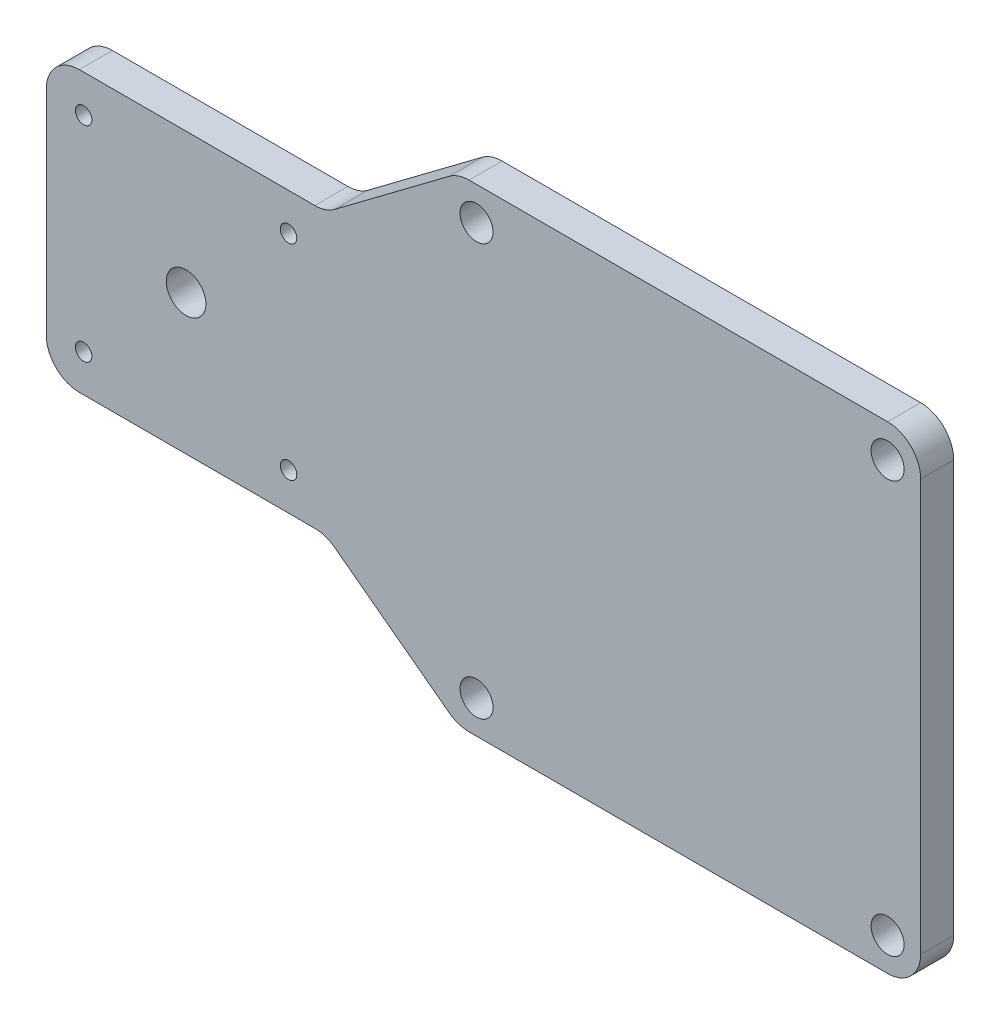
ISO-10303-21;
HEADER;
FILE_DESCRIPTION(('STEP AP214'),'2;1');
FILE_NAME('part.step','',(''),(''),'','','');
FILE_SCHEMA(('AUTOMOTIVE_DESIGN { 1 0 10303 214 1 1 1 1 }'));
ENDSEC;
DATA;
#1=APPLICATION_CONTEXT('core data for automotive mechanical design processes');
#2=APPLICATION_PROTOCOL_DEFINITION('international standard','automotive_design',2000,#1);
#3=PRODUCT_CONTEXT('',#1,'mechanical');
#4=PRODUCT('Part','Part','',(#3));
#5=PRODUCT_RELATED_PRODUCT_CATEGORY('part','',(#4));
#6=PRODUCT_DEFINITION_FORMATION('','',#4);
#7=PRODUCT_DEFINITION_CONTEXT('part definition',#1,'design');
#8=PRODUCT_DEFINITION('design','',#6,#7);
#9=PRODUCT_DEFINITION_SHAPE('','',#8);
#10=(LENGTH_UNIT() NAMED_UNIT(*) SI_UNIT(.MILLI.,.METRE.));
#11=(NAMED_UNIT(*) PLANE_ANGLE_UNIT() SI_UNIT($,.RADIAN.));
#12=(NAMED_UNIT(*) SI_UNIT($,.STERADIAN.) SOLID_ANGLE_UNIT());
#13=UNCERTAINTY_MEASURE_WITH_UNIT(LENGTH_MEASURE(1.E-05),#10,'distance_accuracy_value','');
#14=(GEOMETRIC_REPRESENTATION_CONTEXT(3) GLOBAL_UNCERTAINTY_ASSIGNED_CONTEXT((#13)) GLOBAL_UNIT_ASSIGNED_CONTEXT((#10,
#11,#12)) REPRESENTATION_CONTEXT('',''));
#15=CARTESIAN_POINT('',(0.,0.,0.));
#16=DIRECTION('',(0.,0.,1.));
#17=DIRECTION('',(1.,0.,0.));
#18=AXIS2_PLACEMENT_3D('',#15,#16,#17);
#19=CARTESIAN_POINT('',(-21.15,21.15,5.));
#20=DIRECTION('',(0.,-1.,0.));
#21=DIRECTION('',(0.,0.,-1.));
#22=AXIS2_PLACEMENT_3D('',#19,#20,#21);
#23=PLANE('',#22);
#24=DIRECTION('',(-1.,0.,0.));
#25=VECTOR('',#24,1.);
#26=CARTESIAN_POINT('',(-21.15,21.15,5.));
#27=LINE('',#26,#25);
#28=CARTESIAN_POINT('',(19.4833333333333,21.15,5.));
#29=VERTEX_POINT('',#28);
#30=CARTESIAN_POINT('',(-16.15,21.15,5.));
#31=VERTEX_POINT('',#30);
#32=EDGE_CURVE('E188',#29,#31,#27,.T.);
#33=ORIENTED_EDGE('',*,*,#32,.F.);
#34=DIRECTION('',(0.,0.,-1.));
#35=VECTOR('',#34,1.);
#36=CARTESIAN_POINT('',(19.4833333333333,21.15,0.));
#37=LINE('',#36,#35);
#38=CARTESIAN_POINT('',(19.4833333333333,21.15,0.));
#39=VERTEX_POINT('',#38);
#40=EDGE_CURVE('E204',#29,#39,#37,.T.);
#41=ORIENTED_EDGE('',*,*,#40,.T.);
#42=DIRECTION('',(-1.,0.,0.));
#43=VECTOR('',#42,1.);
#44=CARTESIAN_POINT('',(-21.15,21.15,0.));
#45=LINE('',#44,#43);
#46=CARTESIAN_POINT('',(-16.15,21.15,0.));
#47=VERTEX_POINT('',#46);
#48=EDGE_CURVE('E178',#39,#47,#45,.T.);
#49=ORIENTED_EDGE('',*,*,#48,.T.);
#50=DIRECTION('',(0.,0.,-1.));
#51=VECTOR('',#50,1.);
#52=CARTESIAN_POINT('',(-16.15,21.15,5.));
#53=LINE('',#52,#51);
#54=EDGE_CURVE('E199',#47,#31,#53,.F.);
#55=ORIENTED_EDGE('',*,*,#54,.T.);
#56=EDGE_LOOP('',(#33,#41,#49,#55));
#57=FACE_BOUND('',#56,.T.);
#58=ADVANCED_FACE('F33',(#57),#23,.F.);
#59=CARTESIAN_POINT('',(-21.15,-21.15,5.));
#60=DIRECTION('',(1.,0.,0.));
#61=DIRECTION('',(0.,0.,-1.));
#62=AXIS2_PLACEMENT_3D('',#59,#60,#61);
#63=PLANE('',#62);
#64=DIRECTION('',(0.,-1.,0.));
#65=VECTOR('',#64,1.);
#66=CARTESIAN_POINT('',(-21.15,-21.15,5.));
#67=LINE('',#66,#65);
#68=CARTESIAN_POINT('',(-21.15,16.15,5.));
#69=VERTEX_POINT('',#68);
#70=CARTESIAN_POINT('',(-21.15,-16.15,5.));
#71=VERTEX_POINT('',#70);
#72=EDGE_CURVE('E301',#69,#71,#67,.T.);
#73=ORIENTED_EDGE('',*,*,#72,.F.);
#74=DIRECTION('',(0.,0.,-1.));
#75=VECTOR('',#74,1.);
#76=CARTESIAN_POINT('',(-21.15,16.15,5.));
#77=LINE('',#76,#75);
#78=CARTESIAN_POINT('',(-21.15,16.15,0.));
#79=VERTEX_POINT('',#78);
#80=EDGE_CURVE('E193',#69,#79,#77,.T.);
#81=ORIENTED_EDGE('',*,*,#80,.T.);
#82=DIRECTION('',(0.,-1.,0.));
#83=VECTOR('',#82,1.);
#84=CARTESIAN_POINT('',(-21.15,-21.15,0.));
#85=LINE('',#84,#83);
#86=CARTESIAN_POINT('',(-21.15,-16.15,0.));
#87=VERTEX_POINT('',#86);
#88=EDGE_CURVE('E173',#79,#87,#85,.T.);
#89=ORIENTED_EDGE('',*,*,#88,.T.);
#90=DIRECTION('',(0.,0.,-1.));
#91=VECTOR('',#90,1.);
#92=CARTESIAN_POINT('',(-21.15,-16.15,5.));
#93=LINE('',#92,#91);
#94=EDGE_CURVE('E155',#87,#71,#93,.F.);
#95=ORIENTED_EDGE('',*,*,#94,.T.);
#96=EDGE_LOOP('',(#73,#81,#89,#95));
#97=FACE_BOUND('',#96,.T.);
#98=ADVANCED_FACE('F385',(#97),#63,.F.);
#99=CARTESIAN_POINT('',(-21.15,-21.15,5.));
#100=DIRECTION('',(0.,1.,0.));
#101=DIRECTION('',(0.,0.,1.));
#102=AXIS2_PLACEMENT_3D('',#99,#100,#101);
#103=PLANE('',#102);
#104=DIRECTION('',(1.,0.,0.));
#105=VECTOR('',#104,1.);
#106=CARTESIAN_POINT('',(-21.15,-21.15,0.));
#107=LINE('',#106,#105);
#108=CARTESIAN_POINT('',(-16.15,-21.15,0.));
#109=VERTEX_POINT('',#108);
#110=CARTESIAN_POINT('',(19.4833333333333,-21.15,0.));
#111=VERTEX_POINT('',#110);
#112=EDGE_CURVE('E163',#109,#111,#107,.T.);
#113=ORIENTED_EDGE('',*,*,#112,.T.);
#114=DIRECTION('',(0.,0.,-1.));
#115=VECTOR('',#114,1.);
#116=CARTESIAN_POINT('',(19.4833333333333,-21.15,5.));
#117=LINE('',#116,#115);
#118=CARTESIAN_POINT('',(19.4833333333333,-21.15,5.));
#119=VERTEX_POINT('',#118);
#120=EDGE_CURVE('E218',#111,#119,#117,.F.);
#121=ORIENTED_EDGE('',*,*,#120,.T.);
#122=DIRECTION('',(1.,0.,0.));
#123=VECTOR('',#122,1.);
#124=CARTESIAN_POINT('',(-21.15,-21.15,5.));
#125=LINE('',#124,#123);
#126=CARTESIAN_POINT('',(-16.15,-21.15,5.));
#127=VERTEX_POINT('',#126);
#128=EDGE_CURVE('E166',#127,#119,#125,.T.);
#129=ORIENTED_EDGE('',*,*,#128,.F.);
#130=DIRECTION('',(0.,0.,-1.));
#131=VECTOR('',#130,1.);
#132=CARTESIAN_POINT('',(-16.15,-21.15,5.));
#133=LINE('',#132,#131);
#134=EDGE_CURVE('E153',#127,#109,#133,.T.);
#135=ORIENTED_EDGE('',*,*,#134,.T.);
#136=EDGE_LOOP('',(#113,#121,#129,#135));
#137=FACE_BOUND('',#136,.T.);
#138=ADVANCED_FACE('F162',(#137),#103,.F.);
#139=CARTESIAN_POINT('',(21.15,-21.15,5.));
#140=DIRECTION('',(0.6,0.8,0.));
#141=DIRECTION('',(-0.8,0.6,0.));
#142=AXIS2_PLACEMENT_3D('',#139,#140,#141);
#143=PLANE('',#142);
#144=DIRECTION('',(0.8,-0.6,0.));
#145=VECTOR('',#144,1.);
#146=CARTESIAN_POINT('',(21.15,-21.15,0.));
#147=LINE('',#146,#145);
#148=CARTESIAN_POINT('',(22.4833333333333,-22.15,0.));
#149=VERTEX_POINT('',#148);
#150=CARTESIAN_POINT('',(39.8166666666667,-35.15,0.));
#151=VERTEX_POINT('',#150);
#152=EDGE_CURVE('E172',#149,#151,#147,.T.);
#153=ORIENTED_EDGE('',*,*,#152,.T.);
#154=DIRECTION('',(0.,0.,-1.));
#155=VECTOR('',#154,1.);
#156=CARTESIAN_POINT('',(39.8166666666667,-35.15,5.));
#157=LINE('',#156,#155);
#158=CARTESIAN_POINT('',(39.8166666666667,-35.15,5.));
#159=VERTEX_POINT('',#158);
#160=EDGE_CURVE('E228',#151,#159,#157,.F.);
#161=ORIENTED_EDGE('',*,*,#160,.T.);
#162=DIRECTION('',(0.8,-0.6,0.));
#163=VECTOR('',#162,1.);
#164=CARTESIAN_POINT('',(21.15,-21.15,5.));
#165=LINE('',#164,#163);
#166=CARTESIAN_POINT('',(22.4833333333333,-22.15,5.));
#167=VERTEX_POINT('',#166);
#168=EDGE_CURVE('E297',#167,#159,#165,.T.);
#169=ORIENTED_EDGE('',*,*,#168,.F.);
#170=DIRECTION('',(0.,0.,-1.));
#171=VECTOR('',#170,1.);
#172=CARTESIAN_POINT('',(22.4833333333333,-22.15,0.));
#173=LINE('',#172,#171);
#174=EDGE_CURVE('E215',#167,#149,#173,.T.);
#175=ORIENTED_EDGE('',*,*,#174,.T.);
#176=EDGE_LOOP('',(#153,#161,#169,#175));
#177=FACE_BOUND('',#176,.T.);
#178=ADVANCED_FACE('F392',(#177),#143,.F.);
#179=CARTESIAN_POINT('',(41.15,-36.15,5.));
#180=DIRECTION('',(0.,1.,0.));
#181=DIRECTION('',(-1.,0.,0.));
#182=AXIS2_PLACEMENT_3D('',#179,#180,#181);
#183=PLANE('',#182);
#184=DIRECTION('',(1.,0.,0.));
#185=VECTOR('',#184,1.);
#186=CARTESIAN_POINT('',(41.15,-36.15,0.));
#187=LINE('',#186,#185);
#188=CARTESIAN_POINT('',(42.8166666666667,-36.15,0.));
#189=VERTEX_POINT('',#188);
#190=CARTESIAN_POINT('',(106.15,-36.15,0.));
#191=VERTEX_POINT('',#190);
#192=EDGE_CURVE('E176',#189,#191,#187,.T.);
#193=ORIENTED_EDGE('',*,*,#192,.T.);
#194=DIRECTION('',(0.,0.,-1.));
#195=VECTOR('',#194,1.);
#196=CARTESIAN_POINT('',(106.15,-36.15,5.));
#197=LINE('',#196,#195);
#198=CARTESIAN_POINT('',(106.15,-36.15,5.));
#199=VERTEX_POINT('',#198);
#200=EDGE_CURVE('E42',#191,#199,#197,.F.);
#201=ORIENTED_EDGE('',*,*,#200,.T.);
#202=DIRECTION('',(1.,0.,0.));
#203=VECTOR('',#202,1.);
#204=CARTESIAN_POINT('',(41.15,-36.15,5.));
#205=LINE('',#204,#203);
#206=CARTESIAN_POINT('',(42.8166666666667,-36.15,5.));
#207=VERTEX_POINT('',#206);
#208=EDGE_CURVE('E295',#207,#199,#205,.T.);
#209=ORIENTED_EDGE('',*,*,#208,.F.);
#210=DIRECTION('',(0.,0.,-1.));
#211=VECTOR('',#210,1.);
#212=CARTESIAN_POINT('',(42.8166666666667,-36.15,5.));
#213=LINE('',#212,#211);
#214=EDGE_CURVE('E223',#207,#189,#213,.T.);
#215=ORIENTED_EDGE('',*,*,#214,.T.);
#216=EDGE_LOOP('',(#193,#201,#209,#215));
#217=FACE_BOUND('',#216,.T.);
#218=ADVANCED_FACE('F396',(#217),#183,.F.);
#219=CARTESIAN_POINT('',(111.15,36.15,5.));
#220=DIRECTION('',(-1.,0.,0.));
#221=DIRECTION('',(0.,-1.,0.));
#222=AXIS2_PLACEMENT_3D('',#219,#220,#221);
#223=PLANE('',#222);
#224=DIRECTION('',(0.,1.,0.));
#225=VECTOR('',#224,1.);
#226=CARTESIAN_POINT('',(111.15,36.15,5.));
#227=LINE('',#226,#225);
#228=CARTESIAN_POINT('',(111.15,-31.15,5.));
#229=VERTEX_POINT('',#228);
#230=CARTESIAN_POINT('',(111.15,31.15,5.));
#231=VERTEX_POINT('',#230);
#232=EDGE_CURVE('E293',#229,#231,#227,.T.);
#233=ORIENTED_EDGE('',*,*,#232,.F.);
#234=DIRECTION('',(0.,0.,-1.));
#235=VECTOR('',#234,1.);
#236=CARTESIAN_POINT('',(111.15,-31.15,5.));
#237=LINE('',#236,#235);
#238=CARTESIAN_POINT('',(111.15,-31.15,0.));
#239=VERTEX_POINT('',#238);
#240=EDGE_CURVE('E254',#229,#239,#237,.T.);
#241=ORIENTED_EDGE('',*,*,#240,.T.);
#242=DIRECTION('',(0.,1.,0.));
#243=VECTOR('',#242,1.);
#244=CARTESIAN_POINT('',(111.15,36.15,0.));
#245=LINE('',#244,#243);
#246=CARTESIAN_POINT('',(111.15,31.15,0.));
#247=VERTEX_POINT('',#246);
#248=EDGE_CURVE('E183',#239,#247,#245,.T.);
#249=ORIENTED_EDGE('',*,*,#248,.T.);
#250=DIRECTION('',(0.,0.,-1.));
#251=VECTOR('',#250,1.);
#252=CARTESIAN_POINT('',(111.15,31.15,5.));
#253=LINE('',#252,#251);
#254=EDGE_CURVE('E249',#247,#231,#253,.F.);
#255=ORIENTED_EDGE('',*,*,#254,.T.);
#256=EDGE_LOOP('',(#233,#241,#249,#255));
#257=FACE_BOUND('',#256,.T.);
#258=ADVANCED_FACE('F354',(#257),#223,.F.);
#259=CARTESIAN_POINT('',(41.15,36.15,5.));
#260=DIRECTION('',(0.,-1.,0.));
#261=DIRECTION('',(1.,0.,0.));
#262=AXIS2_PLACEMENT_3D('',#259,#260,#261);
#263=PLANE('',#262);
#264=DIRECTION('',(-1.,0.,0.));
#265=VECTOR('',#264,1.);
#266=CARTESIAN_POINT('',(41.15,36.15,5.));
#267=LINE('',#266,#265);
#268=CARTESIAN_POINT('',(106.15,36.15,5.));
#269=VERTEX_POINT('',#268);
#270=CARTESIAN_POINT('',(42.8166666666667,36.15,5.));
#271=VERTEX_POINT('',#270);
#272=EDGE_CURVE('E291',#269,#271,#267,.T.);
#273=ORIENTED_EDGE('',*,*,#272,.F.);
#274=DIRECTION('',(0.,0.,-1.));
#275=VECTOR('',#274,1.);
#276=CARTESIAN_POINT('',(106.15,36.15,5.));
#277=LINE('',#276,#275);
#278=CARTESIAN_POINT('',(106.15,36.15,0.));
#279=VERTEX_POINT('',#278);
#280=EDGE_CURVE('E243',#269,#279,#277,.T.);
#281=ORIENTED_EDGE('',*,*,#280,.T.);
#282=DIRECTION('',(-1.,0.,0.));
#283=VECTOR('',#282,1.);
#284=CARTESIAN_POINT('',(41.15,36.15,0.));
#285=LINE('',#284,#283);
#286=CARTESIAN_POINT('',(42.8166666666667,36.15,0.));
#287=VERTEX_POINT('',#286);
#288=EDGE_CURVE('E185',#279,#287,#285,.T.);
#289=ORIENTED_EDGE('',*,*,#288,.T.);
#290=DIRECTION('',(0.,0.,-1.));
#291=VECTOR('',#290,1.);
#292=CARTESIAN_POINT('',(42.8166666666667,36.15,5.));
#293=LINE('',#292,#291);
#294=EDGE_CURVE('E238',#287,#271,#293,.F.);
#295=ORIENTED_EDGE('',*,*,#294,.T.);
#296=EDGE_LOOP('',(#273,#281,#289,#295));
#297=FACE_BOUND('',#296,.T.);
#298=ADVANCED_FACE('F363',(#297),#263,.F.);
#299=CARTESIAN_POINT('',(21.15,21.15,5.));
#300=DIRECTION('',(0.6,-0.8,0.));
#301=DIRECTION('',(0.8,0.6,0.));
#302=AXIS2_PLACEMENT_3D('',#299,#300,#301);
#303=PLANE('',#302);
#304=DIRECTION('',(-0.8,-0.6,0.));
#305=VECTOR('',#304,1.);
#306=CARTESIAN_POINT('',(21.15,21.15,5.));
#307=LINE('',#306,#305);
#308=CARTESIAN_POINT('',(39.8166666666667,35.15,5.));
#309=VERTEX_POINT('',#308);
#310=CARTESIAN_POINT('',(22.4833333333333,22.15,5.));
#311=VERTEX_POINT('',#310);
#312=EDGE_CURVE('E167',#309,#311,#307,.T.);
#313=ORIENTED_EDGE('',*,*,#312,.F.);
#314=DIRECTION('',(0.,0.,-1.));
#315=VECTOR('',#314,1.);
#316=CARTESIAN_POINT('',(39.8166666666667,35.15,5.));
#317=LINE('',#316,#315);
#318=CARTESIAN_POINT('',(39.8166666666667,35.15,0.));
#319=VERTEX_POINT('',#318);
#320=EDGE_CURVE('E232',#309,#319,#317,.T.);
#321=ORIENTED_EDGE('',*,*,#320,.T.);
#322=DIRECTION('',(-0.8,-0.6,0.));
#323=VECTOR('',#322,1.);
#324=CARTESIAN_POINT('',(21.15,21.15,0.));
#325=LINE('',#324,#323);
#326=CARTESIAN_POINT('',(22.4833333333333,22.15,0.));
#327=VERTEX_POINT('',#326);
#328=EDGE_CURVE('E187',#319,#327,#325,.T.);
#329=ORIENTED_EDGE('',*,*,#328,.T.);
#330=DIRECTION('',(0.,0.,-1.));
#331=VECTOR('',#330,1.);
#332=CARTESIAN_POINT('',(22.4833333333333,22.15,5.));
#333=LINE('',#332,#331);
#334=EDGE_CURVE('E207',#327,#311,#333,.F.);
#335=ORIENTED_EDGE('',*,*,#334,.T.);
#336=EDGE_LOOP('',(#313,#321,#329,#335));
#337=FACE_BOUND('',#336,.T.);
#338=ADVANCED_FACE('F336',(#337),#303,.F.);
#339=CARTESIAN_POINT('',(0.,0.,5.));
#340=DIRECTION('',(0.,0.,-1.));
#341=DIRECTION('',(-1.,0.,0.));
#342=AXIS2_PLACEMENT_3D('',#339,#340,#341);
#343=PLANE('',#342);
#344=CARTESIAN_POINT('',(106.15,31.15,5.));
#345=DIRECTION('',(0.,0.,1.));
#346=DIRECTION('',(1.,0.,0.));
#347=AXIS2_PLACEMENT_3D('',#344,#345,#346);
#348=CIRCLE('',#347,2.50000000000001);
#349=CARTESIAN_POINT('',(108.65,31.15,5.));
#350=VERTEX_POINT('',#349);
#351=EDGE_CURVE('E313',#350,#350,#348,.T.);
#352=ORIENTED_EDGE('',*,*,#351,.F.);
#353=EDGE_LOOP('',(#352));
#354=FACE_BOUND('',#353,.T.);
#355=CARTESIAN_POINT('',(15.5,-15.5,5.));
#356=DIRECTION('',(0.,0.,1.));
#357=DIRECTION('',(1.,0.,0.));
#358=AXIS2_PLACEMENT_3D('',#355,#356,#357);
#359=CIRCLE('',#358,1.25);
#360=CARTESIAN_POINT('',(16.75,-15.5,5.));
#361=VERTEX_POINT('',#360);
#362=EDGE_CURVE('E310',#361,#361,#359,.T.);
#363=ORIENTED_EDGE('',*,*,#362,.F.);
#364=EDGE_LOOP('',(#363));
#365=FACE_BOUND('',#364,.T.);
#366=CARTESIAN_POINT('',(15.5,15.5,5.));
#367=DIRECTION('',(0.,0.,1.));
#368=DIRECTION('',(1.,0.,0.));
#369=AXIS2_PLACEMENT_3D('',#366,#367,#368);
#370=CIRCLE('',#369,1.25);
#371=CARTESIAN_POINT('',(16.75,15.5,5.));
#372=VERTEX_POINT('',#371);
#373=EDGE_CURVE('E307',#372,#372,#370,.T.);
#374=ORIENTED_EDGE('',*,*,#373,.F.);
#375=EDGE_LOOP('',(#374));
#376=FACE_BOUND('',#375,.T.);
#377=CARTESIAN_POINT('',(-15.5,15.5,5.));
#378=DIRECTION('',(0.,0.,1.));
#379=DIRECTION('',(1.,0.,0.));
#380=AXIS2_PLACEMENT_3D('',#377,#378,#379);
#381=CIRCLE('',#380,1.25);
#382=CARTESIAN_POINT('',(-14.25,15.5,5.));
#383=VERTEX_POINT('',#382);
#384=EDGE_CURVE('E306',#383,#383,#381,.T.);
#385=ORIENTED_EDGE('',*,*,#384,.F.);
#386=EDGE_LOOP('',(#385));
#387=FACE_BOUND('',#386,.T.);
#388=CARTESIAN_POINT('',(106.15,-31.15,5.));
#389=DIRECTION('',(0.,0.,1.));
#390=DIRECTION('',(1.,0.,0.));
#391=AXIS2_PLACEMENT_3D('',#388,#389,#390);
#392=CIRCLE('',#391,2.5);
#393=CARTESIAN_POINT('',(108.65,-31.15,5.));
#394=VERTEX_POINT('',#393);
#395=EDGE_CURVE('E316',#394,#394,#392,.T.);
#396=ORIENTED_EDGE('',*,*,#395,.F.);
#397=EDGE_LOOP('',(#396));
#398=FACE_BOUND('',#397,.T.);
#399=CARTESIAN_POINT('',(43.95,-31.15,5.));
#400=DIRECTION('',(0.,0.,1.));
#401=DIRECTION('',(1.,0.,0.));
#402=AXIS2_PLACEMENT_3D('',#399,#400,#401);
#403=CIRCLE('',#402,2.5);
#404=CARTESIAN_POINT('',(46.45,-31.15,5.));
#405=VERTEX_POINT('',#404);
#406=EDGE_CURVE('E325',#405,#405,#403,.T.);
#407=ORIENTED_EDGE('',*,*,#406,.F.);
#408=EDGE_LOOP('',(#407));
#409=FACE_BOUND('',#408,.T.);
#410=CARTESIAN_POINT('',(43.95,31.15,5.));
#411=DIRECTION('',(0.,0.,1.));
#412=DIRECTION('',(1.,0.,0.));
#413=AXIS2_PLACEMENT_3D('',#410,#411,#412);
#414=CIRCLE('',#413,2.5);
#415=CARTESIAN_POINT('',(46.45,31.15,5.));
#416=VERTEX_POINT('',#415);
#417=EDGE_CURVE('E322',#416,#416,#414,.T.);
#418=ORIENTED_EDGE('',*,*,#417,.F.);
#419=EDGE_LOOP('',(#418));
#420=FACE_BOUND('',#419,.T.);
#421=CARTESIAN_POINT('',(0.,0.,5.));
#422=DIRECTION('',(0.,0.,1.));
#423=DIRECTION('',(1.,0.,0.));
#424=AXIS2_PLACEMENT_3D('',#421,#422,#423);
#425=CIRCLE('',#424,3.);
#426=CARTESIAN_POINT('',(3.,0.,5.));
#427=VERTEX_POINT('',#426);
#428=EDGE_CURVE('E319',#427,#427,#425,.T.);
#429=ORIENTED_EDGE('',*,*,#428,.F.);
#430=EDGE_LOOP('',(#429));
#431=FACE_BOUND('',#430,.T.);
#432=CARTESIAN_POINT('',(-15.5,-15.5,5.));
#433=DIRECTION('',(0.,0.,1.));
#434=DIRECTION('',(1.,0.,0.));
#435=AXIS2_PLACEMENT_3D('',#432,#433,#434);
#436=CIRCLE('',#435,1.25);
#437=CARTESIAN_POINT('',(-14.25,-15.5,5.));
#438=VERTEX_POINT('',#437);
#439=EDGE_CURVE('E263',#438,#438,#436,.T.);
#440=ORIENTED_EDGE('',*,*,#439,.F.);
#441=EDGE_LOOP('',(#440));
#442=FACE_BOUND('',#441,.T.);
#443=ORIENTED_EDGE('',*,*,#208,.T.);
#444=CARTESIAN_POINT('',(106.15,-31.15,5.));
#445=DIRECTION('',(0.,0.,-1.));
#446=DIRECTION('',(-1.,0.,0.));
#447=AXIS2_PLACEMENT_3D('',#444,#445,#446);
#448=CIRCLE('',#447,5.);
#449=EDGE_CURVE('E11',#199,#229,#448,.F.);
#450=ORIENTED_EDGE('',*,*,#449,.T.);
#451=ORIENTED_EDGE('',*,*,#232,.T.);
#452=CARTESIAN_POINT('',(106.15,31.15,5.));
#453=DIRECTION('',(0.,0.,-1.));
#454=DIRECTION('',(-1.,0.,0.));
#455=AXIS2_PLACEMENT_3D('',#452,#453,#454);
#456=CIRCLE('',#455,5.);
#457=EDGE_CURVE('E252',#231,#269,#456,.F.);
#458=ORIENTED_EDGE('',*,*,#457,.T.);
#459=ORIENTED_EDGE('',*,*,#272,.T.);
#460=CARTESIAN_POINT('',(42.8166666666667,31.15,5.));
#461=DIRECTION('',(0.,0.,-1.));
#462=DIRECTION('',(-1.,0.,0.));
#463=AXIS2_PLACEMENT_3D('',#460,#461,#462);
#464=CIRCLE('',#463,5.);
#465=EDGE_CURVE('E241',#271,#309,#464,.F.);
#466=ORIENTED_EDGE('',*,*,#465,.T.);
#467=ORIENTED_EDGE('',*,*,#312,.T.);
#468=CARTESIAN_POINT('',(19.4833333333333,26.15,5.));
#469=DIRECTION('',(0.,0.,-1.));
#470=DIRECTION('',(-1.,0.,0.));
#471=AXIS2_PLACEMENT_3D('',#468,#469,#470);
#472=CIRCLE('',#471,5.);
#473=EDGE_CURVE('E213',#311,#29,#472,.T.);
#474=ORIENTED_EDGE('',*,*,#473,.T.);
#475=ORIENTED_EDGE('',*,*,#32,.T.);
#476=CARTESIAN_POINT('',(-16.15,16.15,5.));
#477=DIRECTION('',(0.,0.,-1.));
#478=DIRECTION('',(-1.,0.,0.));
#479=AXIS2_PLACEMENT_3D('',#476,#477,#478);
#480=CIRCLE('',#479,5.);
#481=EDGE_CURVE('E202',#31,#69,#480,.F.);
#482=ORIENTED_EDGE('',*,*,#481,.T.);
#483=ORIENTED_EDGE('',*,*,#72,.T.);
#484=CARTESIAN_POINT('',(-16.15,-16.15,5.));
#485=DIRECTION('',(0.,0.,-1.));
#486=DIRECTION('',(-1.,0.,0.));
#487=AXIS2_PLACEMENT_3D('',#484,#485,#486);
#488=CIRCLE('',#487,5.);
#489=EDGE_CURVE('E191',#71,#127,#488,.F.);
#490=ORIENTED_EDGE('',*,*,#489,.T.);
#491=ORIENTED_EDGE('',*,*,#128,.T.);
#492=CARTESIAN_POINT('',(19.4833333333333,-26.15,5.));
#493=DIRECTION('',(0.,0.,-1.));
#494=DIRECTION('',(-1.,0.,0.));
#495=AXIS2_PLACEMENT_3D('',#492,#493,#494);
#496=CIRCLE('',#495,5.);
#497=EDGE_CURVE('E221',#119,#167,#496,.T.);
#498=ORIENTED_EDGE('',*,*,#497,.T.);
#499=ORIENTED_EDGE('',*,*,#168,.T.);
#500=CARTESIAN_POINT('',(42.8166666666667,-31.15,5.));
#501=DIRECTION('',(0.,0.,-1.));
#502=DIRECTION('',(-1.,0.,0.));
#503=AXIS2_PLACEMENT_3D('',#500,#501,#502);
#504=CIRCLE('',#503,5.);
#505=EDGE_CURVE('E230',#159,#207,#504,.F.);
#506=ORIENTED_EDGE('',*,*,#505,.T.);
#507=EDGE_LOOP('',(#443,#450,#451,#458,#459,#466,#467,#474,#475,#482,#483,#490,#491,#498,#499,#506));
#508=FACE_BOUND('',#507,.T.);
#509=ADVANCED_FACE('F333',(#354,#365,#376,#387,#398,#409,#420,#431,#442,#508),#343,.F.);
#510=CARTESIAN_POINT('',(0.,0.,0.));
#511=DIRECTION('',(0.,0.,-1.));
#512=DIRECTION('',(-1.,0.,0.));
#513=AXIS2_PLACEMENT_3D('',#510,#511,#512);
#514=PLANE('',#513);
#515=CARTESIAN_POINT('',(106.15,31.15,0.));
#516=DIRECTION('',(0.,0.,-1.));
#517=DIRECTION('',(-1.,0.,0.));
#518=AXIS2_PLACEMENT_3D('',#515,#516,#517);
#519=CIRCLE('',#518,2.50000000000001);
#520=CARTESIAN_POINT('',(103.65,31.15,0.));
#521=VERTEX_POINT('',#520);
#522=EDGE_CURVE('E37',#521,#521,#519,.T.);
#523=ORIENTED_EDGE('',*,*,#522,.F.);
#524=EDGE_LOOP('',(#523));
#525=FACE_BOUND('',#524,.T.);
#526=CARTESIAN_POINT('',(15.5,-15.5,0.));
#527=DIRECTION('',(0.,0.,-1.));
#528=DIRECTION('',(-1.,0.,0.));
#529=AXIS2_PLACEMENT_3D('',#526,#527,#528);
#530=CIRCLE('',#529,1.25);
#531=CARTESIAN_POINT('',(14.25,-15.5,0.));
#532=VERTEX_POINT('',#531);
#533=EDGE_CURVE('E280',#532,#532,#530,.T.);
#534=ORIENTED_EDGE('',*,*,#533,.F.);
#535=EDGE_LOOP('',(#534));
#536=FACE_BOUND('',#535,.T.);
#537=CARTESIAN_POINT('',(15.5,15.5,0.));
#538=DIRECTION('',(0.,0.,-1.));
#539=DIRECTION('',(-1.,0.,0.));
#540=AXIS2_PLACEMENT_3D('',#537,#538,#539);
#541=CIRCLE('',#540,1.25);
#542=CARTESIAN_POINT('',(14.25,15.5,0.));
#543=VERTEX_POINT('',#542);
#544=EDGE_CURVE('E278',#543,#543,#541,.T.);
#545=ORIENTED_EDGE('',*,*,#544,.F.);
#546=EDGE_LOOP('',(#545));
#547=FACE_BOUND('',#546,.T.);
#548=CARTESIAN_POINT('',(-15.5,15.5,0.));
#549=DIRECTION('',(0.,0.,-1.));
#550=DIRECTION('',(-1.,0.,0.));
#551=AXIS2_PLACEMENT_3D('',#548,#549,#550);
#552=CIRCLE('',#551,1.25);
#553=CARTESIAN_POINT('',(-16.75,15.5,0.));
#554=VERTEX_POINT('',#553);
#555=EDGE_CURVE('E275',#554,#554,#552,.T.);
#556=ORIENTED_EDGE('',*,*,#555,.F.);
#557=EDGE_LOOP('',(#556));
#558=FACE_BOUND('',#557,.T.);
#559=CARTESIAN_POINT('',(106.15,-31.15,0.));
#560=DIRECTION('',(0.,0.,-1.));
#561=DIRECTION('',(-1.,0.,0.));
#562=AXIS2_PLACEMENT_3D('',#559,#560,#561);
#563=CIRCLE('',#562,2.5);
#564=CARTESIAN_POINT('',(103.65,-31.15,0.));
#565=VERTEX_POINT('',#564);
#566=EDGE_CURVE('E272',#565,#565,#563,.T.);
#567=ORIENTED_EDGE('',*,*,#566,.F.);
#568=EDGE_LOOP('',(#567));
#569=FACE_BOUND('',#568,.T.);
#570=CARTESIAN_POINT('',(43.95,-31.15,0.));
#571=DIRECTION('',(0.,0.,-1.));
#572=DIRECTION('',(-1.,0.,0.));
#573=AXIS2_PLACEMENT_3D('',#570,#571,#572);
#574=CIRCLE('',#573,2.5);
#575=CARTESIAN_POINT('',(41.45,-31.15,0.));
#576=VERTEX_POINT('',#575);
#577=EDGE_CURVE('E269',#576,#576,#574,.T.);
#578=ORIENTED_EDGE('',*,*,#577,.F.);
#579=EDGE_LOOP('',(#578));
#580=FACE_BOUND('',#579,.T.);
#581=CARTESIAN_POINT('',(43.95,31.15,0.));
#582=DIRECTION('',(0.,0.,-1.));
#583=DIRECTION('',(-1.,0.,0.));
#584=AXIS2_PLACEMENT_3D('',#581,#582,#583);
#585=CIRCLE('',#584,2.5);
#586=CARTESIAN_POINT('',(41.45,31.15,0.));
#587=VERTEX_POINT('',#586);
#588=EDGE_CURVE('E266',#587,#587,#585,.T.);
#589=ORIENTED_EDGE('',*,*,#588,.F.);
#590=EDGE_LOOP('',(#589));
#591=FACE_BOUND('',#590,.T.);
#592=CARTESIAN_POINT('',(0.,0.,0.));
#593=DIRECTION('',(0.,0.,-1.));
#594=DIRECTION('',(-1.,0.,0.));
#595=AXIS2_PLACEMENT_3D('',#592,#593,#594);
#596=CIRCLE('',#595,3.);
#597=CARTESIAN_POINT('',(-3.,0.,0.));
#598=VERTEX_POINT('',#597);
#599=EDGE_CURVE('E262',#598,#598,#596,.T.);
#600=ORIENTED_EDGE('',*,*,#599,.F.);
#601=EDGE_LOOP('',(#600));
#602=FACE_BOUND('',#601,.T.);
#603=CARTESIAN_POINT('',(-15.5,-15.5,0.));
#604=DIRECTION('',(0.,0.,-1.));
#605=DIRECTION('',(-1.,0.,0.));
#606=AXIS2_PLACEMENT_3D('',#603,#604,#605);
#607=CIRCLE('',#606,1.25);
#608=CARTESIAN_POINT('',(-16.75,-15.5,0.));
#609=VERTEX_POINT('',#608);
#610=EDGE_CURVE('E259',#609,#609,#607,.T.);
#611=ORIENTED_EDGE('',*,*,#610,.F.);
#612=EDGE_LOOP('',(#611));
#613=FACE_BOUND('',#612,.T.);
#614=ORIENTED_EDGE('',*,*,#248,.F.);
#615=CARTESIAN_POINT('',(106.15,-31.15,0.));
#616=DIRECTION('',(0.,0.,-1.));
#617=DIRECTION('',(-1.,0.,0.));
#618=AXIS2_PLACEMENT_3D('',#615,#616,#617);
#619=CIRCLE('',#618,5.);
#620=EDGE_CURVE('E57',#239,#191,#619,.T.);
#621=ORIENTED_EDGE('',*,*,#620,.T.);
#622=ORIENTED_EDGE('',*,*,#192,.F.);
#623=CARTESIAN_POINT('',(42.8166666666667,-31.15,0.));
#624=DIRECTION('',(0.,0.,-1.));
#625=DIRECTION('',(-1.,0.,0.));
#626=AXIS2_PLACEMENT_3D('',#623,#624,#625);
#627=CIRCLE('',#626,5.);
#628=EDGE_CURVE('E226',#189,#151,#627,.T.);
#629=ORIENTED_EDGE('',*,*,#628,.T.);
#630=ORIENTED_EDGE('',*,*,#152,.F.);
#631=CARTESIAN_POINT('',(19.4833333333333,-26.15,0.));
#632=DIRECTION('',(0.,0.,-1.));
#633=DIRECTION('',(-1.,0.,0.));
#634=AXIS2_PLACEMENT_3D('',#631,#632,#633);
#635=CIRCLE('',#634,5.);
#636=EDGE_CURVE('E171',#149,#111,#635,.F.);
#637=ORIENTED_EDGE('',*,*,#636,.T.);
#638=ORIENTED_EDGE('',*,*,#112,.F.);
#639=CARTESIAN_POINT('',(-16.15,-16.15,0.));
#640=DIRECTION('',(0.,0.,-1.));
#641=DIRECTION('',(-1.,0.,0.));
#642=AXIS2_PLACEMENT_3D('',#639,#640,#641);
#643=CIRCLE('',#642,5.);
#644=EDGE_CURVE('E149',#109,#87,#643,.T.);
#645=ORIENTED_EDGE('',*,*,#644,.T.);
#646=ORIENTED_EDGE('',*,*,#88,.F.);
#647=CARTESIAN_POINT('',(-16.15,16.15,0.));
#648=DIRECTION('',(0.,0.,-1.));
#649=DIRECTION('',(-1.,0.,0.));
#650=AXIS2_PLACEMENT_3D('',#647,#648,#649);
#651=CIRCLE('',#650,5.);
#652=EDGE_CURVE('E196',#79,#47,#651,.T.);
#653=ORIENTED_EDGE('',*,*,#652,.T.);
#654=ORIENTED_EDGE('',*,*,#48,.F.);
#655=CARTESIAN_POINT('',(19.4833333333333,26.15,0.));
#656=DIRECTION('',(0.,0.,-1.));
#657=DIRECTION('',(-1.,0.,0.));
#658=AXIS2_PLACEMENT_3D('',#655,#656,#657);
#659=CIRCLE('',#658,5.);
#660=EDGE_CURVE('E210',#39,#327,#659,.F.);
#661=ORIENTED_EDGE('',*,*,#660,.T.);
#662=ORIENTED_EDGE('',*,*,#328,.F.);
#663=CARTESIAN_POINT('',(42.8166666666667,31.15,0.));
#664=DIRECTION('',(0.,0.,-1.));
#665=DIRECTION('',(-1.,0.,0.));
#666=AXIS2_PLACEMENT_3D('',#663,#664,#665);
#667=CIRCLE('',#666,5.);
#668=EDGE_CURVE('E235',#319,#287,#667,.T.);
#669=ORIENTED_EDGE('',*,*,#668,.T.);
#670=ORIENTED_EDGE('',*,*,#288,.F.);
#671=CARTESIAN_POINT('',(106.15,31.15,0.));
#672=DIRECTION('',(0.,0.,-1.));
#673=DIRECTION('',(-1.,0.,0.));
#674=AXIS2_PLACEMENT_3D('',#671,#672,#673);
#675=CIRCLE('',#674,5.);
#676=EDGE_CURVE('E246',#279,#247,#675,.T.);
#677=ORIENTED_EDGE('',*,*,#676,.T.);
#678=EDGE_LOOP('',(#614,#621,#622,#629,#630,#637,#638,#645,#646,#653,#654,#661,#662,#669,#670,#677));
#679=FACE_BOUND('',#678,.T.);
#680=ADVANCED_FACE('F169',(#525,#536,#547,#558,#569,#580,#591,#602,#613,#679),#514,.T.);
#681=CARTESIAN_POINT('',(-16.15,-16.15,5.));
#682=DIRECTION('',(0.,0.,-1.));
#683=DIRECTION('',(-1.,0.,0.));
#684=AXIS2_PLACEMENT_3D('',#681,#682,#683);
#685=CYLINDRICAL_SURFACE('',#684,5.);
#686=ORIENTED_EDGE('',*,*,#489,.F.);
#687=ORIENTED_EDGE('',*,*,#94,.F.);
#688=ORIENTED_EDGE('',*,*,#644,.F.);
#689=ORIENTED_EDGE('',*,*,#134,.F.);
#690=EDGE_LOOP('',(#686,#687,#688,#689));
#691=FACE_BOUND('',#690,.T.);
#692=ADVANCED_FACE('F152',(#691),#685,.T.);
#693=CARTESIAN_POINT('',(-16.15,16.15,5.));
#694=DIRECTION('',(0.,0.,-1.));
#695=DIRECTION('',(-1.,0.,0.));
#696=AXIS2_PLACEMENT_3D('',#693,#694,#695);
#697=CYLINDRICAL_SURFACE('',#696,5.);
#698=ORIENTED_EDGE('',*,*,#481,.F.);
#699=ORIENTED_EDGE('',*,*,#54,.F.);
#700=ORIENTED_EDGE('',*,*,#652,.F.);
#701=ORIENTED_EDGE('',*,*,#80,.F.);
#702=EDGE_LOOP('',(#698,#699,#700,#701));
#703=FACE_BOUND('',#702,.T.);
#704=ADVANCED_FACE('F382',(#703),#697,.T.);
#705=CARTESIAN_POINT('',(19.4833333333333,26.15,5.));
#706=DIRECTION('',(0.,0.,1.));
#707=DIRECTION('',(1.,0.,0.));
#708=AXIS2_PLACEMENT_3D('',#705,#706,#707);
#709=CYLINDRICAL_SURFACE('',#708,5.);
#710=ORIENTED_EDGE('',*,*,#473,.F.);
#711=ORIENTED_EDGE('',*,*,#334,.F.);
#712=ORIENTED_EDGE('',*,*,#660,.F.);
#713=ORIENTED_EDGE('',*,*,#40,.F.);
#714=EDGE_LOOP('',(#710,#711,#712,#713));
#715=FACE_BOUND('',#714,.T.);
#716=ADVANCED_FACE('F376',(#715),#709,.F.);
#717=CARTESIAN_POINT('',(19.4833333333333,-26.15,5.));
#718=DIRECTION('',(0.,0.,1.));
#719=DIRECTION('',(1.,0.,0.));
#720=AXIS2_PLACEMENT_3D('',#717,#718,#719);
#721=CYLINDRICAL_SURFACE('',#720,5.);
#722=ORIENTED_EDGE('',*,*,#497,.F.);
#723=ORIENTED_EDGE('',*,*,#120,.F.);
#724=ORIENTED_EDGE('',*,*,#636,.F.);
#725=ORIENTED_EDGE('',*,*,#174,.F.);
#726=EDGE_LOOP('',(#722,#723,#724,#725));
#727=FACE_BOUND('',#726,.T.);
#728=ADVANCED_FACE('F390',(#727),#721,.F.);
#729=CARTESIAN_POINT('',(42.8166666666667,-31.15,5.));
#730=DIRECTION('',(0.,0.,-1.));
#731=DIRECTION('',(-1.,0.,0.));
#732=AXIS2_PLACEMENT_3D('',#729,#730,#731);
#733=CYLINDRICAL_SURFACE('',#732,5.);
#734=ORIENTED_EDGE('',*,*,#505,.F.);
#735=ORIENTED_EDGE('',*,*,#160,.F.);
#736=ORIENTED_EDGE('',*,*,#628,.F.);
#737=ORIENTED_EDGE('',*,*,#214,.F.);
#738=EDGE_LOOP('',(#734,#735,#736,#737));
#739=FACE_BOUND('',#738,.T.);
#740=ADVANCED_FACE('F395',(#739),#733,.T.);
#741=CARTESIAN_POINT('',(42.8166666666667,31.15,5.));
#742=DIRECTION('',(0.,0.,-1.));
#743=DIRECTION('',(-1.,0.,0.));
#744=AXIS2_PLACEMENT_3D('',#741,#742,#743);
#745=CYLINDRICAL_SURFACE('',#744,5.);
#746=ORIENTED_EDGE('',*,*,#465,.F.);
#747=ORIENTED_EDGE('',*,*,#294,.F.);
#748=ORIENTED_EDGE('',*,*,#668,.F.);
#749=ORIENTED_EDGE('',*,*,#320,.F.);
#750=EDGE_LOOP('',(#746,#747,#748,#749));
#751=FACE_BOUND('',#750,.T.);
#752=ADVANCED_FACE('F368',(#751),#745,.T.);
#753=CARTESIAN_POINT('',(106.15,31.15,5.));
#754=DIRECTION('',(0.,0.,-1.));
#755=DIRECTION('',(-1.,0.,0.));
#756=AXIS2_PLACEMENT_3D('',#753,#754,#755);
#757=CYLINDRICAL_SURFACE('',#756,5.);
#758=ORIENTED_EDGE('',*,*,#457,.F.);
#759=ORIENTED_EDGE('',*,*,#254,.F.);
#760=ORIENTED_EDGE('',*,*,#676,.F.);
#761=ORIENTED_EDGE('',*,*,#280,.F.);
#762=EDGE_LOOP('',(#758,#759,#760,#761));
#763=FACE_BOUND('',#762,.T.);
#764=ADVANCED_FACE('F360',(#763),#757,.T.);
#765=CARTESIAN_POINT('',(106.15,-31.15,5.));
#766=DIRECTION('',(0.,0.,-1.));
#767=DIRECTION('',(-1.,0.,0.));
#768=AXIS2_PLACEMENT_3D('',#765,#766,#767);
#769=CYLINDRICAL_SURFACE('',#768,5.);
#770=ORIENTED_EDGE('',*,*,#449,.F.);
#771=ORIENTED_EDGE('',*,*,#200,.F.);
#772=ORIENTED_EDGE('',*,*,#620,.F.);
#773=ORIENTED_EDGE('',*,*,#240,.F.);
#774=EDGE_LOOP('',(#770,#771,#772,#773));
#775=FACE_BOUND('',#774,.T.);
#776=ADVANCED_FACE('F35',(#775),#769,.T.);
#777=CARTESIAN_POINT('',(-15.5,-15.5,-5.));
#778=DIRECTION('',(0.,0.,1.));
#779=DIRECTION('',(1.,0.,0.));
#780=AXIS2_PLACEMENT_3D('',#777,#778,#779);
#781=CYLINDRICAL_SURFACE('',#780,1.25);
#782=ORIENTED_EDGE('',*,*,#610,.T.);
#783=EDGE_LOOP('',(#782));
#784=FACE_BOUND('',#783,.T.);
#785=ORIENTED_EDGE('',*,*,#439,.T.);
#786=EDGE_LOOP('',(#785));
#787=FACE_BOUND('',#786,.T.);
#788=ADVANCED_FACE('F428',(#784,#787),#781,.F.);
#789=CARTESIAN_POINT('',(0.,0.,-5.));
#790=DIRECTION('',(0.,0.,1.));
#791=DIRECTION('',(1.,0.,0.));
#792=AXIS2_PLACEMENT_3D('',#789,#790,#791);
#793=CYLINDRICAL_SURFACE('',#792,3.);
#794=ORIENTED_EDGE('',*,*,#599,.T.);
#795=EDGE_LOOP('',(#794));
#796=FACE_BOUND('',#795,.T.);
#797=ORIENTED_EDGE('',*,*,#428,.T.);
#798=EDGE_LOOP('',(#797));
#799=FACE_BOUND('',#798,.T.);
#800=ADVANCED_FACE('F432',(#796,#799),#793,.F.);
#801=CARTESIAN_POINT('',(43.95,31.15,-5.));
#802=DIRECTION('',(0.,0.,1.));
#803=DIRECTION('',(1.,0.,0.));
#804=AXIS2_PLACEMENT_3D('',#801,#802,#803);
#805=CYLINDRICAL_SURFACE('',#804,2.5);
#806=ORIENTED_EDGE('',*,*,#588,.T.);
#807=EDGE_LOOP('',(#806));
#808=FACE_BOUND('',#807,.T.);
#809=ORIENTED_EDGE('',*,*,#417,.T.);
#810=EDGE_LOOP('',(#809));
#811=FACE_BOUND('',#810,.T.);
#812=ADVANCED_FACE('F438',(#808,#811),#805,.F.);
#813=CARTESIAN_POINT('',(43.95,-31.15,-5.));
#814=DIRECTION('',(0.,0.,1.));
#815=DIRECTION('',(1.,0.,0.));
#816=AXIS2_PLACEMENT_3D('',#813,#814,#815);
#817=CYLINDRICAL_SURFACE('',#816,2.5);
#818=ORIENTED_EDGE('',*,*,#577,.T.);
#819=EDGE_LOOP('',(#818));
#820=FACE_BOUND('',#819,.T.);
#821=ORIENTED_EDGE('',*,*,#406,.T.);
#822=EDGE_LOOP('',(#821));
#823=FACE_BOUND('',#822,.T.);
#824=ADVANCED_FACE('F524',(#820,#823),#817,.F.);
#825=CARTESIAN_POINT('',(106.15,-31.15,-5.));
#826=DIRECTION('',(0.,0.,1.));
#827=DIRECTION('',(1.,0.,0.));
#828=AXIS2_PLACEMENT_3D('',#825,#826,#827);
#829=CYLINDRICAL_SURFACE('',#828,2.5);
#830=ORIENTED_EDGE('',*,*,#566,.T.);
#831=EDGE_LOOP('',(#830));
#832=FACE_BOUND('',#831,.T.);
#833=ORIENTED_EDGE('',*,*,#395,.T.);
#834=EDGE_LOOP('',(#833));
#835=FACE_BOUND('',#834,.T.);
#836=ADVANCED_FACE('F331',(#832,#835),#829,.F.);
#837=CARTESIAN_POINT('',(-15.5,15.5,-5.));
#838=DIRECTION('',(0.,0.,1.));
#839=DIRECTION('',(1.,0.,0.));
#840=AXIS2_PLACEMENT_3D('',#837,#838,#839);
#841=CYLINDRICAL_SURFACE('',#840,1.25);
#842=ORIENTED_EDGE('',*,*,#555,.T.);
#843=EDGE_LOOP('',(#842));
#844=FACE_BOUND('',#843,.T.);
#845=ORIENTED_EDGE('',*,*,#384,.T.);
#846=EDGE_LOOP('',(#845));
#847=FACE_BOUND('',#846,.T.);
#848=ADVANCED_FACE('F541',(#844,#847),#841,.F.);
#849=CARTESIAN_POINT('',(15.5,15.5,-5.));
#850=DIRECTION('',(0.,0.,1.));
#851=DIRECTION('',(1.,0.,0.));
#852=AXIS2_PLACEMENT_3D('',#849,#850,#851);
#853=CYLINDRICAL_SURFACE('',#852,1.25);
#854=ORIENTED_EDGE('',*,*,#544,.T.);
#855=EDGE_LOOP('',(#854));
#856=FACE_BOUND('',#855,.T.);
#857=ORIENTED_EDGE('',*,*,#373,.T.);
#858=EDGE_LOOP('',(#857));
#859=FACE_BOUND('',#858,.T.);
#860=ADVANCED_FACE('F443',(#856,#859),#853,.F.);
#861=CARTESIAN_POINT('',(15.5,-15.5,-5.));
#862=DIRECTION('',(0.,0.,1.));
#863=DIRECTION('',(1.,0.,0.));
#864=AXIS2_PLACEMENT_3D('',#861,#862,#863);
#865=CYLINDRICAL_SURFACE('',#864,1.25);
#866=ORIENTED_EDGE('',*,*,#533,.T.);
#867=EDGE_LOOP('',(#866));
#868=FACE_BOUND('',#867,.T.);
#869=ORIENTED_EDGE('',*,*,#362,.T.);
#870=EDGE_LOOP('',(#869));
#871=FACE_BOUND('',#870,.T.);
#872=ADVANCED_FACE('F557',(#868,#871),#865,.F.);
#873=CARTESIAN_POINT('',(106.15,31.15,-5.));
#874=DIRECTION('',(0.,0.,1.));
#875=DIRECTION('',(1.,0.,0.));
#876=AXIS2_PLACEMENT_3D('',#873,#874,#875);
#877=CYLINDRICAL_SURFACE('',#876,2.50000000000001);
#878=ORIENTED_EDGE('',*,*,#522,.T.);
#879=EDGE_LOOP('',(#878));
#880=FACE_BOUND('',#879,.T.);
#881=ORIENTED_EDGE('',*,*,#351,.T.);
#882=EDGE_LOOP('',(#881));
#883=FACE_BOUND('',#882,.T.);
#884=ADVANCED_FACE('F565',(#880,#883),#877,.F.);
#885=CLOSED_SHELL('',(#58,#98,#138,#178,#218,#258,#298,#338,#509,#680,#692,#704,#716,#728,#740,
#752,#764,#776,#788,#800,#812,#824,#836,#848,#860,#872,#884));
#886=MANIFOLD_SOLID_BREP('B2',#885);
#887=ADVANCED_BREP_SHAPE_REPRESENTATION('',(#18,#886),#14);
#888=SHAPE_DEFINITION_REPRESENTATION(#9,#887);
ENDSEC;
END-ISO-10303-21;
